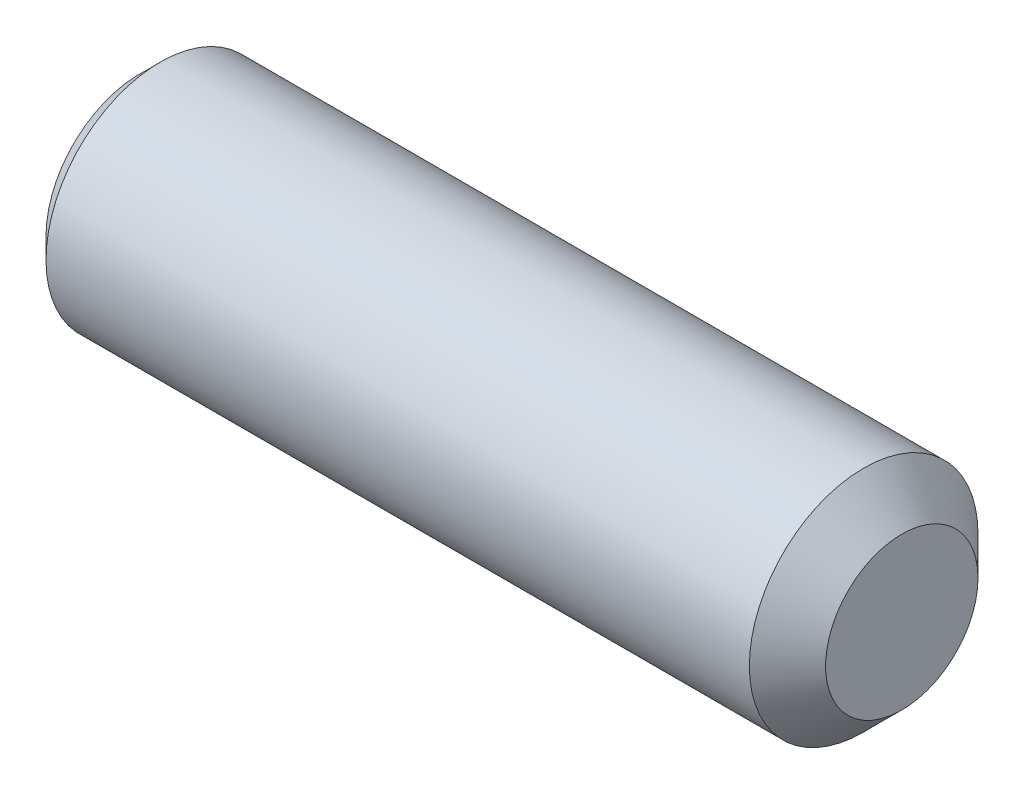
ISO-10303-21;
HEADER;
FILE_DESCRIPTION(('STEP AP214'),'2;1');
FILE_NAME('part.step','',(''),(''),'','','');
FILE_SCHEMA(('AUTOMOTIVE_DESIGN { 1 0 10303 214 1 1 1 1 }'));
ENDSEC;
DATA;
#1=APPLICATION_CONTEXT('core data for automotive mechanical design processes');
#2=APPLICATION_PROTOCOL_DEFINITION('international standard','automotive_design',2000,#1);
#3=PRODUCT_CONTEXT('',#1,'mechanical');
#4=PRODUCT('Part','Part','',(#3));
#5=PRODUCT_RELATED_PRODUCT_CATEGORY('part','',(#4));
#6=PRODUCT_DEFINITION_FORMATION('','',#4);
#7=PRODUCT_DEFINITION_CONTEXT('part definition',#1,'design');
#8=PRODUCT_DEFINITION('design','',#6,#7);
#9=PRODUCT_DEFINITION_SHAPE('','',#8);
#10=(LENGTH_UNIT() NAMED_UNIT(*) SI_UNIT(.MILLI.,.METRE.));
#11=(NAMED_UNIT(*) PLANE_ANGLE_UNIT() SI_UNIT($,.RADIAN.));
#12=(NAMED_UNIT(*) SI_UNIT($,.STERADIAN.) SOLID_ANGLE_UNIT());
#13=UNCERTAINTY_MEASURE_WITH_UNIT(LENGTH_MEASURE(1.E-05),#10,'distance_accuracy_value','');
#14=(GEOMETRIC_REPRESENTATION_CONTEXT(3) GLOBAL_UNCERTAINTY_ASSIGNED_CONTEXT((#13)) GLOBAL_UNIT_ASSIGNED_CONTEXT((#10,
#11,#12)) REPRESENTATION_CONTEXT('',''));
#15=CARTESIAN_POINT('',(0.,0.,0.));
#16=DIRECTION('',(0.,0.,1.));
#17=DIRECTION('',(1.,0.,0.));
#18=AXIS2_PLACEMENT_3D('',#15,#16,#17);
#19=CARTESIAN_POINT('',(10.,0.,0.));
#20=DIRECTION('',(-1.,0.,0.));
#21=DIRECTION('',(0.,0.,1.));
#22=AXIS2_PLACEMENT_3D('',#19,#20,#21);
#23=CYLINDRICAL_SURFACE('',#22,1.5);
#24=CARTESIAN_POINT('',(9.50000000000001,0.,0.));
#25=DIRECTION('',(1.,0.,0.));
#26=DIRECTION('',(0.,0.,-1.));
#27=AXIS2_PLACEMENT_3D('',#24,#25,#26);
#28=CIRCLE('',#27,1.5);
#29=CARTESIAN_POINT('',(9.50000000000001,0.,-1.5));
#30=VERTEX_POINT('',#29);
#31=EDGE_CURVE('E44',#30,#30,#28,.F.);
#32=ORIENTED_EDGE('',*,*,#31,.T.);
#33=EDGE_LOOP('',(#32));
#34=FACE_BOUND('',#33,.T.);
#35=CARTESIAN_POINT('',(0.270625000000004,0.,0.));
#36=DIRECTION('',(-1.,0.,0.));
#37=DIRECTION('',(0.,0.,1.));
#38=AXIS2_PLACEMENT_3D('',#35,#36,#37);
#39=CIRCLE('',#38,1.5);
#40=CARTESIAN_POINT('',(0.270625000000004,0.,1.5));
#41=VERTEX_POINT('',#40);
#42=EDGE_CURVE('E146',#41,#41,#39,.F.);
#43=ORIENTED_EDGE('',*,*,#42,.T.);
#44=EDGE_LOOP('',(#43));
#45=FACE_BOUND('',#44,.T.);
#46=ADVANCED_FACE('F36',(#34,#45),#23,.T.);
#47=CARTESIAN_POINT('',(10.,1.5,0.));
#48=DIRECTION('',(1.,0.,0.));
#49=DIRECTION('',(0.,0.,-1.));
#50=AXIS2_PLACEMENT_3D('',#47,#48,#49);
#51=PLANE('',#50);
#52=CARTESIAN_POINT('',(10.,0.,0.));
#53=DIRECTION('',(1.,0.,0.));
#54=DIRECTION('',(0.,0.,-1.));
#55=AXIS2_PLACEMENT_3D('',#52,#53,#54);
#56=CIRCLE('',#55,1.);
#57=CARTESIAN_POINT('',(10.,0.,-1.));
#58=VERTEX_POINT('',#57);
#59=EDGE_CURVE('E11',#58,#58,#56,.T.);
#60=ORIENTED_EDGE('',*,*,#59,.T.);
#61=EDGE_LOOP('',(#60));
#62=FACE_BOUND('',#61,.T.);
#63=ADVANCED_FACE('F162',(#62),#51,.T.);
#64=CARTESIAN_POINT('',(0.,0.,0.));
#65=DIRECTION('',(-1.,0.,0.));
#66=DIRECTION('',(0.,0.,1.));
#67=AXIS2_PLACEMENT_3D('',#64,#65,#66);
#68=PLANE('',#67);
#69=CARTESIAN_POINT('',(0.,0.,0.));
#70=DIRECTION('',(-1.,0.,0.));
#71=DIRECTION('',(0.,0.,1.));
#72=AXIS2_PLACEMENT_3D('',#69,#70,#71);
#73=CIRCLE('',#72,1.229375);
#74=CARTESIAN_POINT('',(0.,0.,1.229375));
#75=VERTEX_POINT('',#74);
#76=EDGE_CURVE('E138',#75,#75,#73,.T.);
#77=ORIENTED_EDGE('',*,*,#76,.T.);
#78=EDGE_LOOP('',(#77));
#79=FACE_BOUND('',#78,.T.);
#80=DIRECTION('',(0.,-1.,0.));
#81=VECTOR('',#80,1.);
#82=CARTESIAN_POINT('',(0.,0.433012701892219,-0.75));
#83=LINE('',#82,#81);
#84=CARTESIAN_POINT('',(0.,0.433012701892219,-0.75));
#85=VERTEX_POINT('',#84);
#86=CARTESIAN_POINT('',(0.,-0.43301270189222,-0.75));
#87=VERTEX_POINT('',#86);
#88=EDGE_CURVE('E51',#85,#87,#83,.T.);
#89=ORIENTED_EDGE('',*,*,#88,.F.);
#90=DIRECTION('',(0.,-0.500000000000001,-0.866025403784438));
#91=VECTOR('',#90,1.);
#92=CARTESIAN_POINT('',(0.,0.866025403784439,0.));
#93=LINE('',#92,#91);
#94=CARTESIAN_POINT('',(0.,0.866025403784439,0.));
#95=VERTEX_POINT('',#94);
#96=EDGE_CURVE('E134',#95,#85,#93,.T.);
#97=ORIENTED_EDGE('',*,*,#96,.F.);
#98=DIRECTION('',(0.,0.5,-0.866025403784439));
#99=VECTOR('',#98,1.);
#100=CARTESIAN_POINT('',(0.,0.43301270189222,0.75));
#101=LINE('',#100,#99);
#102=CARTESIAN_POINT('',(0.,0.43301270189222,0.75));
#103=VERTEX_POINT('',#102);
#104=EDGE_CURVE('E132',#103,#95,#101,.T.);
#105=ORIENTED_EDGE('',*,*,#104,.F.);
#106=DIRECTION('',(0.,1.,0.));
#107=VECTOR('',#106,1.);
#108=CARTESIAN_POINT('',(0.,-0.433012701892218,0.75));
#109=LINE('',#108,#107);
#110=CARTESIAN_POINT('',(0.,-0.433012701892218,0.75));
#111=VERTEX_POINT('',#110);
#112=EDGE_CURVE('E99',#111,#103,#109,.T.);
#113=ORIENTED_EDGE('',*,*,#112,.F.);
#114=DIRECTION('',(0.,0.500000000000001,0.866025403784438));
#115=VECTOR('',#114,1.);
#116=CARTESIAN_POINT('',(0.,-0.866025403784439,0.));
#117=LINE('',#116,#115);
#118=CARTESIAN_POINT('',(0.,-0.866025403784439,0.));
#119=VERTEX_POINT('',#118);
#120=EDGE_CURVE('E128',#119,#111,#117,.T.);
#121=ORIENTED_EDGE('',*,*,#120,.F.);
#122=DIRECTION('',(0.,-0.5,0.866025403784439));
#123=VECTOR('',#122,1.);
#124=CARTESIAN_POINT('',(0.,-0.43301270189222,-0.75));
#125=LINE('',#124,#123);
#126=EDGE_CURVE('E125',#87,#119,#125,.T.);
#127=ORIENTED_EDGE('',*,*,#126,.F.);
#128=EDGE_LOOP('',(#89,#97,#105,#113,#121,#127));
#129=FACE_BOUND('',#128,.T.);
#130=ADVANCED_FACE('F167',(#79,#129),#68,.T.);
#131=CARTESIAN_POINT('',(1.2,0.433012701892219,-0.75));
#132=DIRECTION('',(0.,0.,-1.));
#133=DIRECTION('',(-1.,0.,0.));
#134=AXIS2_PLACEMENT_3D('',#131,#132,#133);
#135=PLANE('',#134);
#136=ORIENTED_EDGE('',*,*,#88,.T.);
#137=DIRECTION('',(-1.,0.,0.));
#138=VECTOR('',#137,1.);
#139=CARTESIAN_POINT('',(1.2,-0.43301270189222,-0.75));
#140=LINE('',#139,#138);
#141=CARTESIAN_POINT('',(1.2,-0.43301270189222,-0.75));
#142=VERTEX_POINT('',#141);
#143=EDGE_CURVE('E81',#142,#87,#140,.T.);
#144=ORIENTED_EDGE('',*,*,#143,.F.);
#145=DIRECTION('',(0.,-1.,0.));
#146=VECTOR('',#145,1.);
#147=CARTESIAN_POINT('',(1.2,0.433012701892219,-0.75));
#148=LINE('',#147,#146);
#149=CARTESIAN_POINT('',(1.2,0.433012701892219,-0.75));
#150=VERTEX_POINT('',#149);
#151=EDGE_CURVE('E136',#150,#142,#148,.T.);
#152=ORIENTED_EDGE('',*,*,#151,.F.);
#153=DIRECTION('',(-1.,0.,0.));
#154=VECTOR('',#153,1.);
#155=CARTESIAN_POINT('',(1.2,0.433012701892219,-0.75));
#156=LINE('',#155,#154);
#157=EDGE_CURVE('E59',#150,#85,#156,.T.);
#158=ORIENTED_EDGE('',*,*,#157,.T.);
#159=EDGE_LOOP('',(#136,#144,#152,#158));
#160=FACE_BOUND('',#159,.T.);
#161=ADVANCED_FACE('F173',(#160),#135,.F.);
#162=CARTESIAN_POINT('',(1.2,0.866025403784439,0.));
#163=DIRECTION('',(0.,0.866025403784438,-0.500000000000001));
#164=DIRECTION('',(0.,0.500000000000001,0.866025403784438));
#165=AXIS2_PLACEMENT_3D('',#162,#163,#164);
#166=PLANE('',#165);
#167=ORIENTED_EDGE('',*,*,#96,.T.);
#168=ORIENTED_EDGE('',*,*,#157,.F.);
#169=DIRECTION('',(0.,-0.500000000000001,-0.866025403784438));
#170=VECTOR('',#169,1.);
#171=CARTESIAN_POINT('',(1.2,0.866025403784439,0.));
#172=LINE('',#171,#170);
#173=CARTESIAN_POINT('',(1.2,0.866025403784439,0.));
#174=VERTEX_POINT('',#173);
#175=EDGE_CURVE('E111',#174,#150,#172,.T.);
#176=ORIENTED_EDGE('',*,*,#175,.F.);
#177=DIRECTION('',(-1.,0.,0.));
#178=VECTOR('',#177,1.);
#179=CARTESIAN_POINT('',(1.2,0.866025403784439,0.));
#180=LINE('',#179,#178);
#181=EDGE_CURVE('E103',#174,#95,#180,.T.);
#182=ORIENTED_EDGE('',*,*,#181,.T.);
#183=EDGE_LOOP('',(#167,#168,#176,#182));
#184=FACE_BOUND('',#183,.T.);
#185=ADVANCED_FACE('F177',(#184),#166,.F.);
#186=CARTESIAN_POINT('',(1.2,0.43301270189222,0.75));
#187=DIRECTION('',(0.,0.866025403784439,0.5));
#188=DIRECTION('',(0.,-0.5,0.866025403784439));
#189=AXIS2_PLACEMENT_3D('',#186,#187,#188);
#190=PLANE('',#189);
#191=ORIENTED_EDGE('',*,*,#104,.T.);
#192=ORIENTED_EDGE('',*,*,#181,.F.);
#193=DIRECTION('',(0.,0.5,-0.866025403784439));
#194=VECTOR('',#193,1.);
#195=CARTESIAN_POINT('',(1.2,0.43301270189222,0.75));
#196=LINE('',#195,#194);
#197=CARTESIAN_POINT('',(1.2,0.43301270189222,0.75));
#198=VERTEX_POINT('',#197);
#199=EDGE_CURVE('E107',#198,#174,#196,.T.);
#200=ORIENTED_EDGE('',*,*,#199,.F.);
#201=DIRECTION('',(-1.,0.,0.));
#202=VECTOR('',#201,1.);
#203=CARTESIAN_POINT('',(1.2,0.43301270189222,0.75));
#204=LINE('',#203,#202);
#205=EDGE_CURVE('E92',#198,#103,#204,.T.);
#206=ORIENTED_EDGE('',*,*,#205,.T.);
#207=EDGE_LOOP('',(#191,#192,#200,#206));
#208=FACE_BOUND('',#207,.T.);
#209=ADVANCED_FACE('F108',(#208),#190,.F.);
#210=CARTESIAN_POINT('',(1.2,-0.433012701892218,0.75));
#211=DIRECTION('',(0.,0.,1.));
#212=DIRECTION('',(1.,0.,0.));
#213=AXIS2_PLACEMENT_3D('',#210,#211,#212);
#214=PLANE('',#213);
#215=ORIENTED_EDGE('',*,*,#112,.T.);
#216=ORIENTED_EDGE('',*,*,#205,.F.);
#217=DIRECTION('',(0.,1.,0.));
#218=VECTOR('',#217,1.);
#219=CARTESIAN_POINT('',(1.2,-0.433012701892218,0.75));
#220=LINE('',#219,#218);
#221=CARTESIAN_POINT('',(1.2,-0.433012701892218,0.75));
#222=VERTEX_POINT('',#221);
#223=EDGE_CURVE('E96',#222,#198,#220,.T.);
#224=ORIENTED_EDGE('',*,*,#223,.F.);
#225=DIRECTION('',(-1.,0.,0.));
#226=VECTOR('',#225,1.);
#227=CARTESIAN_POINT('',(1.2,-0.433012701892218,0.75));
#228=LINE('',#227,#226);
#229=EDGE_CURVE('E104',#222,#111,#228,.T.);
#230=ORIENTED_EDGE('',*,*,#229,.T.);
#231=EDGE_LOOP('',(#215,#216,#224,#230));
#232=FACE_BOUND('',#231,.T.);
#233=ADVANCED_FACE('F94',(#232),#214,.F.);
#234=CARTESIAN_POINT('',(1.2,-0.866025403784439,0.));
#235=DIRECTION('',(0.,-0.866025403784438,0.500000000000001));
#236=DIRECTION('',(0.,-0.500000000000001,-0.866025403784438));
#237=AXIS2_PLACEMENT_3D('',#234,#235,#236);
#238=PLANE('',#237);
#239=ORIENTED_EDGE('',*,*,#120,.T.);
#240=ORIENTED_EDGE('',*,*,#229,.F.);
#241=DIRECTION('',(0.,0.500000000000001,0.866025403784438));
#242=VECTOR('',#241,1.);
#243=CARTESIAN_POINT('',(1.2,-0.866025403784439,0.));
#244=LINE('',#243,#242);
#245=CARTESIAN_POINT('',(1.2,-0.866025403784439,0.));
#246=VERTEX_POINT('',#245);
#247=EDGE_CURVE('E117',#246,#222,#244,.T.);
#248=ORIENTED_EDGE('',*,*,#247,.F.);
#249=DIRECTION('',(-1.,0.,0.));
#250=VECTOR('',#249,1.);
#251=CARTESIAN_POINT('',(1.2,-0.866025403784439,0.));
#252=LINE('',#251,#250);
#253=EDGE_CURVE('E141',#246,#119,#252,.T.);
#254=ORIENTED_EDGE('',*,*,#253,.T.);
#255=EDGE_LOOP('',(#239,#240,#248,#254));
#256=FACE_BOUND('',#255,.T.);
#257=ADVANCED_FACE('F181',(#256),#238,.F.);
#258=CARTESIAN_POINT('',(1.2,-0.43301270189222,-0.75));
#259=DIRECTION('',(0.,-0.866025403784439,-0.5));
#260=DIRECTION('',(0.,0.5,-0.866025403784439));
#261=AXIS2_PLACEMENT_3D('',#258,#259,#260);
#262=PLANE('',#261);
#263=ORIENTED_EDGE('',*,*,#126,.T.);
#264=ORIENTED_EDGE('',*,*,#253,.F.);
#265=DIRECTION('',(0.,-0.5,0.866025403784439));
#266=VECTOR('',#265,1.);
#267=CARTESIAN_POINT('',(1.2,-0.43301270189222,-0.75));
#268=LINE('',#267,#266);
#269=EDGE_CURVE('E119',#142,#246,#268,.T.);
#270=ORIENTED_EDGE('',*,*,#269,.F.);
#271=ORIENTED_EDGE('',*,*,#143,.T.);
#272=EDGE_LOOP('',(#263,#264,#270,#271));
#273=FACE_BOUND('',#272,.T.);
#274=ADVANCED_FACE('F178',(#273),#262,.F.);
#275=CARTESIAN_POINT('',(1.2,0.,0.));
#276=DIRECTION('',(-1.,0.,0.));
#277=DIRECTION('',(0.,0.,1.));
#278=AXIS2_PLACEMENT_3D('',#275,#276,#277);
#279=PLANE('',#278);
#280=ORIENTED_EDGE('',*,*,#151,.T.);
#281=ORIENTED_EDGE('',*,*,#269,.T.);
#282=ORIENTED_EDGE('',*,*,#247,.T.);
#283=ORIENTED_EDGE('',*,*,#223,.T.);
#284=ORIENTED_EDGE('',*,*,#199,.T.);
#285=ORIENTED_EDGE('',*,*,#175,.T.);
#286=EDGE_LOOP('',(#280,#281,#282,#283,#284,#285));
#287=FACE_BOUND('',#286,.T.);
#288=ADVANCED_FACE('F114',(#287),#279,.T.);
#289=CARTESIAN_POINT('',(0.,0.,0.));
#290=DIRECTION('',(1.,0.,0.));
#291=DIRECTION('',(0.,0.,-1.));
#292=AXIS2_PLACEMENT_3D('',#289,#290,#291);
#293=CONICAL_SURFACE('',#292,1.229375,0.785398163397443);
#294=ORIENTED_EDGE('',*,*,#42,.F.);
#295=EDGE_LOOP('',(#294));
#296=FACE_BOUND('',#295,.T.);
#297=ORIENTED_EDGE('',*,*,#76,.F.);
#298=EDGE_LOOP('',(#297));
#299=FACE_BOUND('',#298,.T.);
#300=ADVANCED_FACE('F154',(#296,#299),#293,.T.);
#301=CARTESIAN_POINT('',(9.50000000000001,0.,0.));
#302=DIRECTION('',(-1.,0.,0.));
#303=DIRECTION('',(0.,0.,1.));
#304=AXIS2_PLACEMENT_3D('',#301,#302,#303);
#305=CONICAL_SURFACE('',#304,1.5,0.785398163397451);
#306=ORIENTED_EDGE('',*,*,#59,.F.);
#307=EDGE_LOOP('',(#306));
#308=FACE_BOUND('',#307,.T.);
#309=ORIENTED_EDGE('',*,*,#31,.F.);
#310=EDGE_LOOP('',(#309));
#311=FACE_BOUND('',#310,.T.);
#312=ADVANCED_FACE('F38',(#308,#311),#305,.T.);
#313=CLOSED_SHELL('',(#46,#63,#130,#161,#185,#209,#233,#257,#274,#288,#300,#312));
#314=MANIFOLD_SOLID_BREP('B2',#313);
#315=ADVANCED_BREP_SHAPE_REPRESENTATION('',(#18,#314),#14);
#316=SHAPE_DEFINITION_REPRESENTATION(#9,#315);
ENDSEC;
END-ISO-10303-21;
